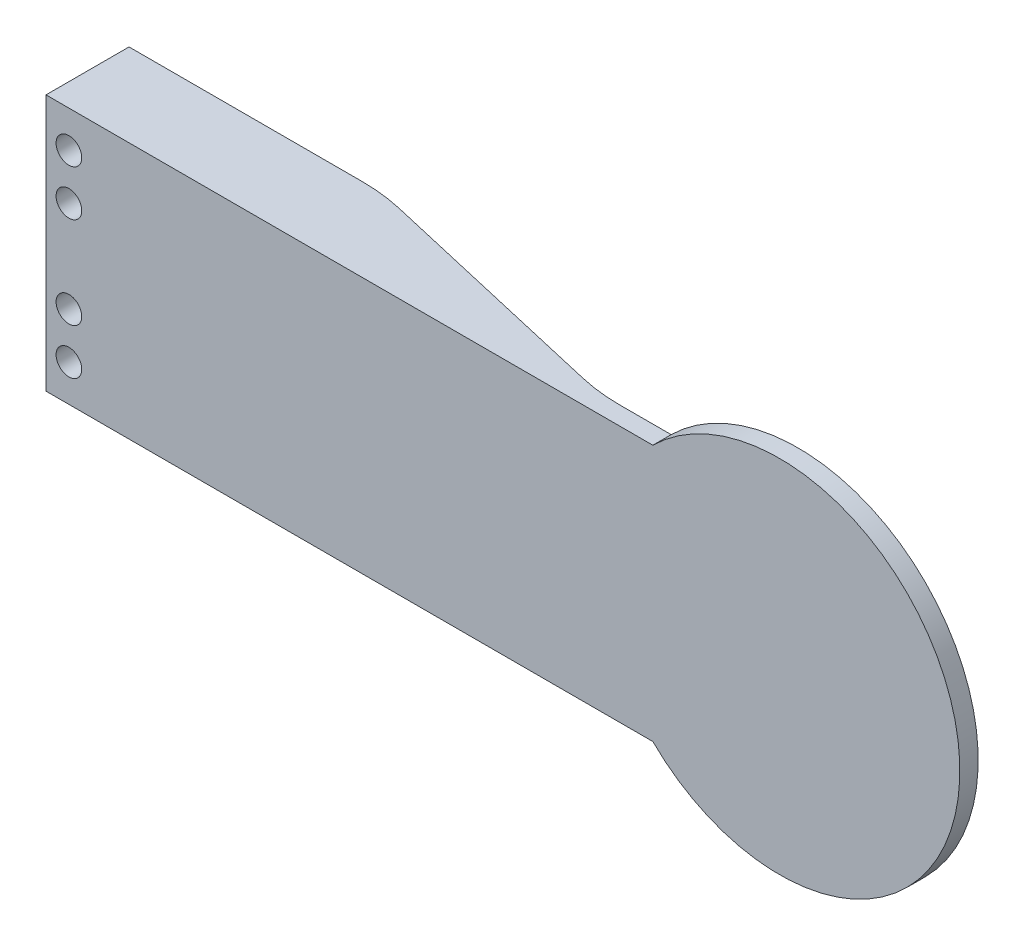
ISO-10303-21;
HEADER;
FILE_DESCRIPTION(('STEP AP214'),'2;1');
FILE_NAME('part.step','',(''),(''),'','','');
FILE_SCHEMA(('AUTOMOTIVE_DESIGN { 1 0 10303 214 1 1 1 1 }'));
ENDSEC;
DATA;
#1=APPLICATION_CONTEXT('core data for automotive mechanical design processes');
#2=APPLICATION_PROTOCOL_DEFINITION('international standard','automotive_design',2000,#1);
#3=PRODUCT_CONTEXT('',#1,'mechanical');
#4=PRODUCT('Part','Part','',(#3));
#5=PRODUCT_RELATED_PRODUCT_CATEGORY('part','',(#4));
#6=PRODUCT_DEFINITION_FORMATION('','',#4);
#7=PRODUCT_DEFINITION_CONTEXT('part definition',#1,'design');
#8=PRODUCT_DEFINITION('design','',#6,#7);
#9=PRODUCT_DEFINITION_SHAPE('','',#8);
#10=(LENGTH_UNIT() NAMED_UNIT(*) SI_UNIT(.MILLI.,.METRE.));
#11=(NAMED_UNIT(*) PLANE_ANGLE_UNIT() SI_UNIT($,.RADIAN.));
#12=(NAMED_UNIT(*) SI_UNIT($,.STERADIAN.) SOLID_ANGLE_UNIT());
#13=UNCERTAINTY_MEASURE_WITH_UNIT(LENGTH_MEASURE(1.E-05),#10,'distance_accuracy_value','');
#14=(GEOMETRIC_REPRESENTATION_CONTEXT(3) GLOBAL_UNCERTAINTY_ASSIGNED_CONTEXT((#13)) GLOBAL_UNIT_ASSIGNED_CONTEXT((#10,
#11,#12)) REPRESENTATION_CONTEXT('',''));
#15=CARTESIAN_POINT('',(0.,0.,0.));
#16=DIRECTION('',(0.,0.,1.));
#17=DIRECTION('',(1.,0.,0.));
#18=AXIS2_PLACEMENT_3D('',#15,#16,#17);
#19=CARTESIAN_POINT('',(0.,0.,9.06));
#20=DIRECTION('',(0.,0.,-1.));
#21=DIRECTION('',(-1.,0.,0.));
#22=AXIS2_PLACEMENT_3D('',#19,#20,#21);
#23=PLANE('',#22);
#24=CARTESIAN_POINT('',(2.50000000000219,3.9999999999989,9.06));
#25=DIRECTION('',(0.,0.,1.));
#26=DIRECTION('',(1.,0.,0.));
#27=AXIS2_PLACEMENT_3D('',#24,#25,#26);
#28=CIRCLE('',#27,1.3999999999999);
#29=CARTESIAN_POINT('',(3.90000000000209,3.9999999999989,9.06));
#30=VERTEX_POINT('',#29);
#31=EDGE_CURVE('E137',#30,#30,#28,.T.);
#32=ORIENTED_EDGE('',*,*,#31,.F.);
#33=EDGE_LOOP('',(#32));
#34=FACE_BOUND('',#33,.T.);
#35=CARTESIAN_POINT('',(2.50000000000218,8.9999999999989,9.06));
#36=DIRECTION('',(0.,0.,1.));
#37=DIRECTION('',(1.,0.,0.));
#38=AXIS2_PLACEMENT_3D('',#35,#36,#37);
#39=CIRCLE('',#38,1.3999999999999);
#40=CARTESIAN_POINT('',(3.90000000000208,8.9999999999989,9.06));
#41=VERTEX_POINT('',#40);
#42=EDGE_CURVE('E150',#41,#41,#39,.T.);
#43=ORIENTED_EDGE('',*,*,#42,.F.);
#44=EDGE_LOOP('',(#43));
#45=FACE_BOUND('',#44,.T.);
#46=CARTESIAN_POINT('',(2.50000000000218,18.9999999999989,9.06));
#47=DIRECTION('',(0.,0.,1.));
#48=DIRECTION('',(1.,0.,0.));
#49=AXIS2_PLACEMENT_3D('',#46,#47,#48);
#50=CIRCLE('',#49,1.3999999999999);
#51=CARTESIAN_POINT('',(3.90000000000208,18.9999999999989,9.06));
#52=VERTEX_POINT('',#51);
#53=EDGE_CURVE('E146',#52,#52,#50,.T.);
#54=ORIENTED_EDGE('',*,*,#53,.F.);
#55=EDGE_LOOP('',(#54));
#56=FACE_BOUND('',#55,.T.);
#57=CARTESIAN_POINT('',(2.50000000000218,23.9999999999989,9.06));
#58=DIRECTION('',(0.,0.,1.));
#59=DIRECTION('',(1.,0.,0.));
#60=AXIS2_PLACEMENT_3D('',#57,#58,#59);
#61=CIRCLE('',#60,1.3999999999999);
#62=CARTESIAN_POINT('',(3.90000000000208,23.9999999999989,9.06));
#63=VERTEX_POINT('',#62);
#64=EDGE_CURVE('E141',#63,#63,#61,.T.);
#65=ORIENTED_EDGE('',*,*,#64,.F.);
#66=EDGE_LOOP('',(#65));
#67=FACE_BOUND('',#66,.T.);
#68=CARTESIAN_POINT('',(80.034999999998,13.9999999999956,9.06));
#69=DIRECTION('',(0.,0.,1.));
#70=DIRECTION('',(1.,0.,0.));
#71=AXIS2_PLACEMENT_3D('',#68,#69,#70);
#72=CIRCLE('',#71,19.675);
#73=CARTESIAN_POINT('',(66.2109041886936,0.,9.06));
#74=VERTEX_POINT('',#73);
#75=CARTESIAN_POINT('',(66.2109041887025,28.,9.06));
#76=VERTEX_POINT('',#75);
#77=EDGE_CURVE('E119',#74,#76,#72,.T.);
#78=ORIENTED_EDGE('',*,*,#77,.T.);
#79=DIRECTION('',(-1.,0.,0.));
#80=VECTOR('',#79,1.);
#81=CARTESIAN_POINT('',(0.,28.,9.06));
#82=LINE('',#81,#80);
#83=CARTESIAN_POINT('',(0.,28.,9.06));
#84=VERTEX_POINT('',#83);
#85=EDGE_CURVE('E125',#76,#84,#82,.T.);
#86=ORIENTED_EDGE('',*,*,#85,.T.);
#87=DIRECTION('',(0.,-1.,0.));
#88=VECTOR('',#87,1.);
#89=CARTESIAN_POINT('',(0.,0.,9.06));
#90=LINE('',#89,#88);
#91=CARTESIAN_POINT('',(0.,0.,9.06));
#92=VERTEX_POINT('',#91);
#93=EDGE_CURVE('E157',#84,#92,#90,.T.);
#94=ORIENTED_EDGE('',*,*,#93,.T.);
#95=DIRECTION('',(1.,0.,0.));
#96=VECTOR('',#95,1.);
#97=CARTESIAN_POINT('',(0.,0.,9.06));
#98=LINE('',#97,#96);
#99=EDGE_CURVE('E161',#92,#74,#98,.T.);
#100=ORIENTED_EDGE('',*,*,#99,.T.);
#101=EDGE_LOOP('',(#78,#86,#94,#100));
#102=FACE_BOUND('',#101,.T.);
#103=ADVANCED_FACE('F40',(#34,#45,#56,#67,#102),#23,.F.);
#104=CARTESIAN_POINT('',(100.,28.,7.06));
#105=DIRECTION('',(0.,0.,1.));
#106=DIRECTION('',(0.,-1.,0.));
#107=AXIS2_PLACEMENT_3D('',#104,#105,#106);
#108=PLANE('',#107);
#109=DIRECTION('',(-1.,0.,0.));
#110=VECTOR('',#109,1.);
#111=CARTESIAN_POINT('',(100.,0.,7.06));
#112=LINE('',#111,#110);
#113=CARTESIAN_POINT('',(66.2109041886936,0.,7.06));
#114=VERTEX_POINT('',#113);
#115=CARTESIAN_POINT('',(60.5934709088764,0.,7.06));
#116=VERTEX_POINT('',#115);
#117=EDGE_CURVE('E133',#114,#116,#112,.T.);
#118=ORIENTED_EDGE('',*,*,#117,.T.);
#119=DIRECTION('',(0.,-1.,0.));
#120=VECTOR('',#119,1.);
#121=CARTESIAN_POINT('',(60.5934709088764,28.,7.06));
#122=LINE('',#121,#120);
#123=CARTESIAN_POINT('',(60.5934709088764,28.,7.06));
#124=VERTEX_POINT('',#123);
#125=EDGE_CURVE('E131',#116,#124,#122,.F.);
#126=ORIENTED_EDGE('',*,*,#125,.T.);
#127=DIRECTION('',(-1.,0.,0.));
#128=VECTOR('',#127,1.);
#129=CARTESIAN_POINT('',(100.,28.,7.06));
#130=LINE('',#129,#128);
#131=CARTESIAN_POINT('',(66.2109041887025,28.,7.06));
#132=VERTEX_POINT('',#131);
#133=EDGE_CURVE('E123',#132,#124,#130,.T.);
#134=ORIENTED_EDGE('',*,*,#133,.F.);
#135=CARTESIAN_POINT('',(80.034999999998,13.9999999999956,7.06));
#136=DIRECTION('',(0.,0.,1.));
#137=DIRECTION('',(1.,0.,0.));
#138=AXIS2_PLACEMENT_3D('',#135,#136,#137);
#139=CIRCLE('',#138,19.675);
#140=EDGE_CURVE('E107',#114,#132,#139,.T.);
#141=ORIENTED_EDGE('',*,*,#140,.F.);
#142=EDGE_LOOP('',(#118,#126,#134,#141));
#143=FACE_BOUND('',#142,.T.);
#144=ADVANCED_FACE('F129',(#143),#108,.F.);
#145=CARTESIAN_POINT('',(0.,0.,9.06));
#146=DIRECTION('',(0.,1.,0.));
#147=DIRECTION('',(0.,0.,1.));
#148=AXIS2_PLACEMENT_3D('',#145,#146,#147);
#149=PLANE('',#148);
#150=DIRECTION('',(1.,0.,0.));
#151=VECTOR('',#150,1.);
#152=CARTESIAN_POINT('',(0.,0.,0.));
#153=LINE('',#152,#151);
#154=CARTESIAN_POINT('',(0.,0.,0.));
#155=VERTEX_POINT('',#154);
#156=CARTESIAN_POINT('',(25.4558269043641,0.,0.));
#157=VERTEX_POINT('',#156);
#158=EDGE_CURVE('E173',#155,#157,#153,.T.);
#159=ORIENTED_EDGE('',*,*,#158,.T.);
#160=CARTESIAN_POINT('',(25.4558269043641,0.,20.));
#161=DIRECTION('',(0.,1.,0.));
#162=DIRECTION('',(0.,0.,1.));
#163=AXIS2_PLACEMENT_3D('',#160,#161,#162);
#164=CIRCLE('',#163,20.);
#165=CARTESIAN_POINT('',(29.9548479912413,0.,0.512598704295277));
#166=VERTEX_POINT('',#165);
#167=EDGE_CURVE('E56',#157,#166,#164,.F.);
#168=ORIENTED_EDGE('',*,*,#167,.T.);
#169=DIRECTION('',(-0.974370064785236,0.,-0.224951054343862));
#170=VECTOR('',#169,1.);
#171=CARTESIAN_POINT('',(3.38927153349072,0.,-5.62054787871335));
#172=LINE('',#171,#170);
#173=CARTESIAN_POINT('',(56.0944498219992,0.,6.54740129570472));
#174=VERTEX_POINT('',#173);
#175=EDGE_CURVE('E204',#166,#174,#172,.F.);
#176=ORIENTED_EDGE('',*,*,#175,.T.);
#177=CARTESIAN_POINT('',(60.5934709088764,0.,-12.94));
#178=DIRECTION('',(0.,1.,0.));
#179=DIRECTION('',(0.,0.,1.));
#180=AXIS2_PLACEMENT_3D('',#177,#178,#179);
#181=CIRCLE('',#180,20.);
#182=EDGE_CURVE('E11',#174,#116,#181,.T.);
#183=ORIENTED_EDGE('',*,*,#182,.T.);
#184=ORIENTED_EDGE('',*,*,#117,.F.);
#185=DIRECTION('',(0.,0.,1.));
#186=VECTOR('',#185,1.);
#187=CARTESIAN_POINT('',(66.2109041886936,0.,7.06));
#188=LINE('',#187,#186);
#189=EDGE_CURVE('E113',#114,#74,#188,.T.);
#190=ORIENTED_EDGE('',*,*,#189,.T.);
#191=ORIENTED_EDGE('',*,*,#99,.F.);
#192=DIRECTION('',(0.,0.,-1.));
#193=VECTOR('',#192,1.);
#194=CARTESIAN_POINT('',(0.,0.,9.06));
#195=LINE('',#194,#193);
#196=EDGE_CURVE('E183',#92,#155,#195,.T.);
#197=ORIENTED_EDGE('',*,*,#196,.T.);
#198=EDGE_LOOP('',(#159,#168,#176,#183,#184,#190,#191,#197));
#199=FACE_BOUND('',#198,.T.);
#200=ADVANCED_FACE('F232',(#199),#149,.F.);
#201=CARTESIAN_POINT('',(0.,0.,9.06));
#202=DIRECTION('',(1.,0.,0.));
#203=DIRECTION('',(0.,0.,-1.));
#204=AXIS2_PLACEMENT_3D('',#201,#202,#203);
#205=PLANE('',#204);
#206=DIRECTION('',(0.,-1.,0.));
#207=VECTOR('',#206,1.);
#208=CARTESIAN_POINT('',(0.,0.,0.));
#209=LINE('',#208,#207);
#210=CARTESIAN_POINT('',(0.,28.,0.));
#211=VERTEX_POINT('',#210);
#212=EDGE_CURVE('E169',#211,#155,#209,.T.);
#213=ORIENTED_EDGE('',*,*,#212,.T.);
#214=ORIENTED_EDGE('',*,*,#196,.F.);
#215=ORIENTED_EDGE('',*,*,#93,.F.);
#216=DIRECTION('',(0.,0.,-1.));
#217=VECTOR('',#216,1.);
#218=CARTESIAN_POINT('',(0.,28.,9.06));
#219=LINE('',#218,#217);
#220=EDGE_CURVE('E168',#84,#211,#219,.T.);
#221=ORIENTED_EDGE('',*,*,#220,.T.);
#222=EDGE_LOOP('',(#213,#214,#215,#221));
#223=FACE_BOUND('',#222,.T.);
#224=ADVANCED_FACE('F239',(#223),#205,.F.);
#225=CARTESIAN_POINT('',(0.,28.,9.06));
#226=DIRECTION('',(0.,-1.,0.));
#227=DIRECTION('',(0.,0.,-1.));
#228=AXIS2_PLACEMENT_3D('',#225,#226,#227);
#229=PLANE('',#228);
#230=DIRECTION('',(0.974370064785236,0.,0.224951054343862));
#231=VECTOR('',#230,1.);
#232=CARTESIAN_POINT('',(3.38927153349072,28.,-5.62054787871334));
#233=LINE('',#232,#231);
#234=CARTESIAN_POINT('',(56.0944498219992,28.,6.54740129570472));
#235=VERTEX_POINT('',#234);
#236=CARTESIAN_POINT('',(29.9548479912413,28.,0.512598704295278));
#237=VERTEX_POINT('',#236);
#238=EDGE_CURVE('E187',#235,#237,#233,.F.);
#239=ORIENTED_EDGE('',*,*,#238,.T.);
#240=CARTESIAN_POINT('',(25.455826904364,28.,20.));
#241=DIRECTION('',(0.,-1.,0.));
#242=DIRECTION('',(0.,0.,-1.));
#243=AXIS2_PLACEMENT_3D('',#240,#241,#242);
#244=CIRCLE('',#243,20.);
#245=CARTESIAN_POINT('',(25.455826904364,28.,0.));
#246=VERTEX_POINT('',#245);
#247=EDGE_CURVE('E64',#237,#246,#244,.F.);
#248=ORIENTED_EDGE('',*,*,#247,.T.);
#249=DIRECTION('',(-1.,0.,0.));
#250=VECTOR('',#249,1.);
#251=CARTESIAN_POINT('',(0.,28.,0.));
#252=LINE('',#251,#250);
#253=EDGE_CURVE('E162',#246,#211,#252,.T.);
#254=ORIENTED_EDGE('',*,*,#253,.T.);
#255=ORIENTED_EDGE('',*,*,#220,.F.);
#256=ORIENTED_EDGE('',*,*,#85,.F.);
#257=DIRECTION('',(0.,0.,1.));
#258=VECTOR('',#257,1.);
#259=CARTESIAN_POINT('',(66.2109041887025,28.,7.06));
#260=LINE('',#259,#258);
#261=EDGE_CURVE('E110',#76,#132,#260,.F.);
#262=ORIENTED_EDGE('',*,*,#261,.T.);
#263=ORIENTED_EDGE('',*,*,#133,.T.);
#264=CARTESIAN_POINT('',(60.5934709088764,28.,-12.94));
#265=DIRECTION('',(0.,-1.,0.));
#266=DIRECTION('',(0.,0.,-1.));
#267=AXIS2_PLACEMENT_3D('',#264,#265,#266);
#268=CIRCLE('',#267,20.);
#269=EDGE_CURVE('E49',#124,#235,#268,.T.);
#270=ORIENTED_EDGE('',*,*,#269,.T.);
#271=EDGE_LOOP('',(#239,#248,#254,#255,#256,#262,#263,#270));
#272=FACE_BOUND('',#271,.T.);
#273=ADVANCED_FACE('F122',(#272),#229,.F.);
#274=CARTESIAN_POINT('',(0.,0.,0.));
#275=DIRECTION('',(0.,0.,-1.));
#276=DIRECTION('',(-1.,0.,0.));
#277=AXIS2_PLACEMENT_3D('',#274,#275,#276);
#278=PLANE('',#277);
#279=CARTESIAN_POINT('',(2.50000000000218,23.9999999999989,0.));
#280=DIRECTION('',(0.,0.,-1.));
#281=DIRECTION('',(-1.,0.,0.));
#282=AXIS2_PLACEMENT_3D('',#279,#280,#281);
#283=CIRCLE('',#282,1.3999999999999);
#284=CARTESIAN_POINT('',(1.10000000000229,23.9999999999989,0.));
#285=VERTEX_POINT('',#284);
#286=EDGE_CURVE('E174',#285,#285,#283,.T.);
#287=ORIENTED_EDGE('',*,*,#286,.F.);
#288=EDGE_LOOP('',(#287));
#289=FACE_BOUND('',#288,.T.);
#290=CARTESIAN_POINT('',(2.50000000000218,18.9999999999989,0.));
#291=DIRECTION('',(0.,0.,-1.));
#292=DIRECTION('',(-1.,0.,0.));
#293=AXIS2_PLACEMENT_3D('',#290,#291,#292);
#294=CIRCLE('',#293,1.3999999999999);
#295=CARTESIAN_POINT('',(1.10000000000229,18.9999999999989,0.));
#296=VERTEX_POINT('',#295);
#297=EDGE_CURVE('E195',#296,#296,#294,.T.);
#298=ORIENTED_EDGE('',*,*,#297,.F.);
#299=EDGE_LOOP('',(#298));
#300=FACE_BOUND('',#299,.T.);
#301=CARTESIAN_POINT('',(2.50000000000218,8.9999999999989,0.));
#302=DIRECTION('',(0.,0.,-1.));
#303=DIRECTION('',(-1.,0.,0.));
#304=AXIS2_PLACEMENT_3D('',#301,#302,#303);
#305=CIRCLE('',#304,1.3999999999999);
#306=CARTESIAN_POINT('',(1.10000000000229,8.9999999999989,0.));
#307=VERTEX_POINT('',#306);
#308=EDGE_CURVE('E191',#307,#307,#305,.T.);
#309=ORIENTED_EDGE('',*,*,#308,.F.);
#310=EDGE_LOOP('',(#309));
#311=FACE_BOUND('',#310,.T.);
#312=CARTESIAN_POINT('',(2.50000000000219,3.9999999999989,0.));
#313=DIRECTION('',(0.,0.,-1.));
#314=DIRECTION('',(-1.,0.,0.));
#315=AXIS2_PLACEMENT_3D('',#312,#313,#314);
#316=CIRCLE('',#315,1.3999999999999);
#317=CARTESIAN_POINT('',(1.10000000000229,3.9999999999989,0.));
#318=VERTEX_POINT('',#317);
#319=EDGE_CURVE('E145',#318,#318,#316,.T.);
#320=ORIENTED_EDGE('',*,*,#319,.F.);
#321=EDGE_LOOP('',(#320));
#322=FACE_BOUND('',#321,.T.);
#323=ORIENTED_EDGE('',*,*,#253,.F.);
#324=DIRECTION('',(0.,1.,0.));
#325=VECTOR('',#324,1.);
#326=CARTESIAN_POINT('',(25.4558269043641,0.,0.));
#327=LINE('',#326,#325);
#328=EDGE_CURVE('E216',#246,#157,#327,.F.);
#329=ORIENTED_EDGE('',*,*,#328,.T.);
#330=ORIENTED_EDGE('',*,*,#158,.F.);
#331=ORIENTED_EDGE('',*,*,#212,.F.);
#332=EDGE_LOOP('',(#323,#329,#330,#331));
#333=FACE_BOUND('',#332,.T.);
#334=ADVANCED_FACE('F234',(#289,#300,#311,#322,#333),#278,.T.);
#335=CARTESIAN_POINT('',(2.50000000000219,3.9999999999989,-16.94));
#336=DIRECTION('',(0.,0.,1.));
#337=DIRECTION('',(1.,0.,0.));
#338=AXIS2_PLACEMENT_3D('',#335,#336,#337);
#339=CYLINDRICAL_SURFACE('',#338,1.3999999999999);
#340=ORIENTED_EDGE('',*,*,#319,.T.);
#341=EDGE_LOOP('',(#340));
#342=FACE_BOUND('',#341,.T.);
#343=ORIENTED_EDGE('',*,*,#31,.T.);
#344=EDGE_LOOP('',(#343));
#345=FACE_BOUND('',#344,.T.);
#346=ADVANCED_FACE('F255',(#342,#345),#339,.F.);
#347=CARTESIAN_POINT('',(2.50000000000218,8.9999999999989,-16.94));
#348=DIRECTION('',(0.,0.,1.));
#349=DIRECTION('',(1.,0.,0.));
#350=AXIS2_PLACEMENT_3D('',#347,#348,#349);
#351=CYLINDRICAL_SURFACE('',#350,1.3999999999999);
#352=ORIENTED_EDGE('',*,*,#308,.T.);
#353=EDGE_LOOP('',(#352));
#354=FACE_BOUND('',#353,.T.);
#355=ORIENTED_EDGE('',*,*,#42,.T.);
#356=EDGE_LOOP('',(#355));
#357=FACE_BOUND('',#356,.T.);
#358=ADVANCED_FACE('F286',(#354,#357),#351,.F.);
#359=CARTESIAN_POINT('',(2.50000000000218,18.9999999999989,-16.94));
#360=DIRECTION('',(0.,0.,1.));
#361=DIRECTION('',(1.,0.,0.));
#362=AXIS2_PLACEMENT_3D('',#359,#360,#361);
#363=CYLINDRICAL_SURFACE('',#362,1.3999999999999);
#364=ORIENTED_EDGE('',*,*,#297,.T.);
#365=EDGE_LOOP('',(#364));
#366=FACE_BOUND('',#365,.T.);
#367=ORIENTED_EDGE('',*,*,#53,.T.);
#368=EDGE_LOOP('',(#367));
#369=FACE_BOUND('',#368,.T.);
#370=ADVANCED_FACE('F283',(#366,#369),#363,.F.);
#371=CARTESIAN_POINT('',(2.50000000000218,23.9999999999989,-16.94));
#372=DIRECTION('',(0.,0.,1.));
#373=DIRECTION('',(1.,0.,0.));
#374=AXIS2_PLACEMENT_3D('',#371,#372,#373);
#375=CYLINDRICAL_SURFACE('',#374,1.3999999999999);
#376=ORIENTED_EDGE('',*,*,#286,.T.);
#377=EDGE_LOOP('',(#376));
#378=FACE_BOUND('',#377,.T.);
#379=ORIENTED_EDGE('',*,*,#64,.T.);
#380=EDGE_LOOP('',(#379));
#381=FACE_BOUND('',#380,.T.);
#382=ADVANCED_FACE('F270',(#378,#381),#375,.F.);
#383=CARTESIAN_POINT('',(58.3147587428435,28.,7.06));
#384=DIRECTION('',(0.224951054343862,0.,-0.974370064785236));
#385=DIRECTION('',(0.,-1.,0.));
#386=AXIS2_PLACEMENT_3D('',#383,#384,#385);
#387=PLANE('',#386);
#388=ORIENTED_EDGE('',*,*,#238,.F.);
#389=DIRECTION('',(0.,1.,0.));
#390=VECTOR('',#389,1.);
#391=CARTESIAN_POINT('',(56.0944498219992,0.,6.54740129570472));
#392=LINE('',#391,#390);
#393=EDGE_CURVE('E213',#235,#174,#392,.F.);
#394=ORIENTED_EDGE('',*,*,#393,.T.);
#395=ORIENTED_EDGE('',*,*,#175,.F.);
#396=DIRECTION('',(0.,-1.,0.));
#397=VECTOR('',#396,1.);
#398=CARTESIAN_POINT('',(29.9548479912413,28.,0.512598704295271));
#399=LINE('',#398,#397);
#400=EDGE_CURVE('E210',#166,#237,#399,.F.);
#401=ORIENTED_EDGE('',*,*,#400,.T.);
#402=EDGE_LOOP('',(#388,#394,#395,#401));
#403=FACE_BOUND('',#402,.T.);
#404=ADVANCED_FACE('F227',(#403),#387,.T.);
#405=CARTESIAN_POINT('',(80.034999999998,13.9999999999956,7.06));
#406=DIRECTION('',(0.,0.,1.));
#407=DIRECTION('',(1.,0.,0.));
#408=AXIS2_PLACEMENT_3D('',#405,#406,#407);
#409=CYLINDRICAL_SURFACE('',#408,19.675);
#410=ORIENTED_EDGE('',*,*,#189,.F.);
#411=ORIENTED_EDGE('',*,*,#140,.T.);
#412=ORIENTED_EDGE('',*,*,#261,.F.);
#413=ORIENTED_EDGE('',*,*,#77,.F.);
#414=EDGE_LOOP('',(#410,#411,#412,#413));
#415=FACE_BOUND('',#414,.T.);
#416=ADVANCED_FACE('F109',(#415),#409,.T.);
#417=CARTESIAN_POINT('',(60.5934709088764,28.,-12.94));
#418=DIRECTION('',(0.,1.,0.));
#419=DIRECTION('',(0.,0.,1.));
#420=AXIS2_PLACEMENT_3D('',#417,#418,#419);
#421=CYLINDRICAL_SURFACE('',#420,20.);
#422=ORIENTED_EDGE('',*,*,#182,.F.);
#423=ORIENTED_EDGE('',*,*,#393,.F.);
#424=ORIENTED_EDGE('',*,*,#269,.F.);
#425=ORIENTED_EDGE('',*,*,#125,.F.);
#426=EDGE_LOOP('',(#422,#423,#424,#425));
#427=FACE_BOUND('',#426,.T.);
#428=ADVANCED_FACE('F230',(#427),#421,.F.);
#429=CARTESIAN_POINT('',(25.4558269043641,0.,20.));
#430=DIRECTION('',(0.,-1.,0.));
#431=DIRECTION('',(1.,0.,0.));
#432=AXIS2_PLACEMENT_3D('',#429,#430,#431);
#433=CYLINDRICAL_SURFACE('',#432,20.);
#434=ORIENTED_EDGE('',*,*,#247,.F.);
#435=ORIENTED_EDGE('',*,*,#400,.F.);
#436=ORIENTED_EDGE('',*,*,#167,.F.);
#437=ORIENTED_EDGE('',*,*,#328,.F.);
#438=EDGE_LOOP('',(#434,#435,#436,#437));
#439=FACE_BOUND('',#438,.T.);
#440=ADVANCED_FACE('F42',(#439),#433,.T.);
#441=CLOSED_SHELL('',(#103,#144,#200,#224,#273,#334,#346,#358,#370,#382,#404,#416,#428,#440));
#442=MANIFOLD_SOLID_BREP('B2',#441);
#443=ADVANCED_BREP_SHAPE_REPRESENTATION('',(#18,#442),#14);
#444=SHAPE_DEFINITION_REPRESENTATION(#9,#443);
ENDSEC;
END-ISO-10303-21;
